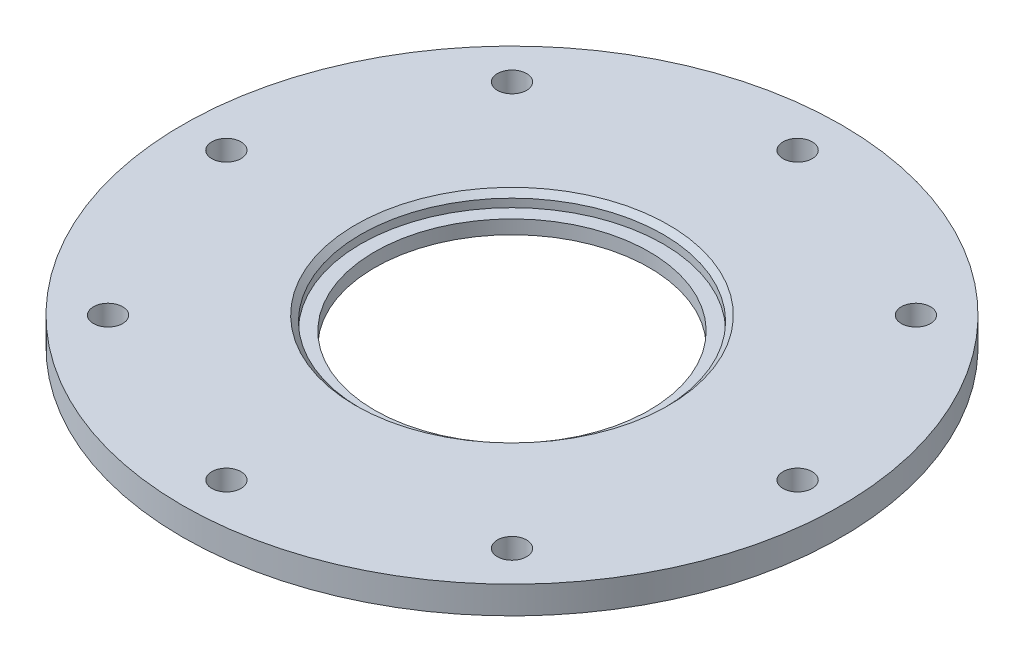
ISO-10303-21;
HEADER;
FILE_DESCRIPTION(('STEP AP214'),'2;1');
FILE_NAME('part.step','',(''),(''),'','','');
FILE_SCHEMA(('AUTOMOTIVE_DESIGN { 1 0 10303 214 1 1 1 1 }'));
ENDSEC;
DATA;
#1=APPLICATION_CONTEXT('core data for automotive mechanical design processes');
#2=APPLICATION_PROTOCOL_DEFINITION('international standard','automotive_design',2000,#1);
#3=PRODUCT_CONTEXT('',#1,'mechanical');
#4=PRODUCT('Part','Part','',(#3));
#5=PRODUCT_RELATED_PRODUCT_CATEGORY('part','',(#4));
#6=PRODUCT_DEFINITION_FORMATION('','',#4);
#7=PRODUCT_DEFINITION_CONTEXT('part definition',#1,'design');
#8=PRODUCT_DEFINITION('design','',#6,#7);
#9=PRODUCT_DEFINITION_SHAPE('','',#8);
#10=(LENGTH_UNIT() NAMED_UNIT(*) SI_UNIT(.MILLI.,.METRE.));
#11=(NAMED_UNIT(*) PLANE_ANGLE_UNIT() SI_UNIT($,.RADIAN.));
#12=(NAMED_UNIT(*) SI_UNIT($,.STERADIAN.) SOLID_ANGLE_UNIT());
#13=UNCERTAINTY_MEASURE_WITH_UNIT(LENGTH_MEASURE(1.E-05),#10,'distance_accuracy_value','');
#14=(GEOMETRIC_REPRESENTATION_CONTEXT(3) GLOBAL_UNCERTAINTY_ASSIGNED_CONTEXT((#13)) GLOBAL_UNIT_ASSIGNED_CONTEXT((#10,
#11,#12)) REPRESENTATION_CONTEXT('',''));
#15=CARTESIAN_POINT('',(0.,0.,0.));
#16=DIRECTION('',(0.,0.,1.));
#17=DIRECTION('',(1.,0.,0.));
#18=AXIS2_PLACEMENT_3D('',#15,#16,#17);
#19=CARTESIAN_POINT('',(0.,6.35,0.));
#20=DIRECTION('',(0.,1.,0.));
#21=DIRECTION('',(0.,0.,1.));
#22=AXIS2_PLACEMENT_3D('',#19,#20,#21);
#23=PLANE('',#22);
#24=CARTESIAN_POINT('',(0.,6.35,0.));
#25=DIRECTION('',(0.,1.,0.));
#26=DIRECTION('',(0.,0.,1.));
#27=AXIS2_PLACEMENT_3D('',#24,#25,#26);
#28=CIRCLE('',#27,36.195);
#29=CARTESIAN_POINT('',(0.,6.35,36.195));
#30=VERTEX_POINT('',#29);
#31=EDGE_CURVE('E40',#30,#30,#28,.F.);
#32=ORIENTED_EDGE('',*,*,#31,.T.);
#33=EDGE_LOOP('',(#32));
#34=FACE_BOUND('',#33,.T.);
#35=CARTESIAN_POINT('',(46.697331829559,6.35,46.6973318295602));
#36=DIRECTION('',(0.,1.,0.));
#37=DIRECTION('',(0.,0.,1.));
#38=AXIS2_PLACEMENT_3D('',#35,#36,#37);
#39=CIRCLE('',#38,3.3782);
#40=CARTESIAN_POINT('',(46.697331829559,6.35,50.0755318295602));
#41=VERTEX_POINT('',#40);
#42=EDGE_CURVE('E101',#41,#41,#39,.T.);
#43=ORIENTED_EDGE('',*,*,#42,.F.);
#44=EDGE_LOOP('',(#43));
#45=FACE_BOUND('',#44,.T.);
#46=CARTESIAN_POINT('',(66.04,6.35,6.83644715390033E-13));
#47=DIRECTION('',(0.,1.,0.));
#48=DIRECTION('',(0.,0.,1.));
#49=AXIS2_PLACEMENT_3D('',#46,#47,#48);
#50=CIRCLE('',#49,3.3782);
#51=CARTESIAN_POINT('',(66.04,6.35,3.37820000000068));
#52=VERTEX_POINT('',#51);
#53=EDGE_CURVE('E95',#52,#52,#50,.T.);
#54=ORIENTED_EDGE('',*,*,#53,.F.);
#55=EDGE_LOOP('',(#54));
#56=FACE_BOUND('',#55,.T.);
#57=CARTESIAN_POINT('',(46.69733182956,6.35,-46.6973318295592));
#58=DIRECTION('',(0.,1.,0.));
#59=DIRECTION('',(0.,0.,1.));
#60=AXIS2_PLACEMENT_3D('',#57,#58,#59);
#61=CIRCLE('',#60,3.3782);
#62=CARTESIAN_POINT('',(46.69733182956,6.35,-43.3191318295592));
#63=VERTEX_POINT('',#62);
#64=EDGE_CURVE('E89',#63,#63,#61,.T.);
#65=ORIENTED_EDGE('',*,*,#64,.F.);
#66=EDGE_LOOP('',(#65));
#67=FACE_BOUND('',#66,.T.);
#68=CARTESIAN_POINT('',(0.,6.35,-66.04));
#69=DIRECTION('',(0.,1.,0.));
#70=DIRECTION('',(0.,0.,1.));
#71=AXIS2_PLACEMENT_3D('',#68,#69,#70);
#72=CIRCLE('',#71,3.3782);
#73=CARTESIAN_POINT('',(0.,6.35,-62.6618));
#74=VERTEX_POINT('',#73);
#75=EDGE_CURVE('E83',#74,#74,#72,.T.);
#76=ORIENTED_EDGE('',*,*,#75,.F.);
#77=EDGE_LOOP('',(#76));
#78=FACE_BOUND('',#77,.T.);
#79=CARTESIAN_POINT('',(-46.6973318295594,6.35,-46.6973318295598));
#80=DIRECTION('',(0.,1.,0.));
#81=DIRECTION('',(0.,0.,1.));
#82=AXIS2_PLACEMENT_3D('',#79,#80,#81);
#83=CIRCLE('',#82,3.3782);
#84=CARTESIAN_POINT('',(-46.6973318295594,6.35,-43.3191318295598));
#85=VERTEX_POINT('',#84);
#86=EDGE_CURVE('E77',#85,#85,#83,.T.);
#87=ORIENTED_EDGE('',*,*,#86,.F.);
#88=EDGE_LOOP('',(#87));
#89=FACE_BOUND('',#88,.T.);
#90=CARTESIAN_POINT('',(-66.04,6.35,-2.22489860155631E-13));
#91=DIRECTION('',(0.,1.,0.));
#92=DIRECTION('',(0.,0.,1.));
#93=AXIS2_PLACEMENT_3D('',#90,#91,#92);
#94=CIRCLE('',#93,3.3782);
#95=CARTESIAN_POINT('',(-66.04,6.35,3.37819999999978));
#96=VERTEX_POINT('',#95);
#97=EDGE_CURVE('E71',#96,#96,#94,.T.);
#98=ORIENTED_EDGE('',*,*,#97,.F.);
#99=EDGE_LOOP('',(#98));
#100=FACE_BOUND('',#99,.T.);
#101=CARTESIAN_POINT('',(-46.6973318295597,6.35,46.6973318295595));
#102=DIRECTION('',(0.,1.,0.));
#103=DIRECTION('',(0.,0.,1.));
#104=AXIS2_PLACEMENT_3D('',#101,#102,#103);
#105=CIRCLE('',#104,3.3782);
#106=CARTESIAN_POINT('',(-46.6973318295597,6.35,50.0755318295595));
#107=VERTEX_POINT('',#106);
#108=EDGE_CURVE('E65',#107,#107,#105,.T.);
#109=ORIENTED_EDGE('',*,*,#108,.F.);
#110=EDGE_LOOP('',(#109));
#111=FACE_BOUND('',#110,.T.);
#112=CARTESIAN_POINT('',(0.,6.35,66.04));
#113=DIRECTION('',(0.,1.,0.));
#114=DIRECTION('',(0.,0.,1.));
#115=AXIS2_PLACEMENT_3D('',#112,#113,#114);
#116=CIRCLE('',#115,3.3782);
#117=CARTESIAN_POINT('',(0.,6.35,69.4182));
#118=VERTEX_POINT('',#117);
#119=EDGE_CURVE('E59',#118,#118,#116,.T.);
#120=ORIENTED_EDGE('',*,*,#119,.F.);
#121=EDGE_LOOP('',(#120));
#122=FACE_BOUND('',#121,.T.);
#123=CARTESIAN_POINT('',(0.,6.35,0.));
#124=DIRECTION('',(0.,1.,0.));
#125=DIRECTION('',(0.,0.,1.));
#126=AXIS2_PLACEMENT_3D('',#123,#124,#125);
#127=CIRCLE('',#126,76.2);
#128=CARTESIAN_POINT('',(0.,6.35,76.2));
#129=VERTEX_POINT('',#128);
#130=EDGE_CURVE('E48',#129,#129,#127,.T.);
#131=ORIENTED_EDGE('',*,*,#130,.T.);
#132=EDGE_LOOP('',(#131));
#133=FACE_BOUND('',#132,.T.);
#134=ADVANCED_FACE('F33',(#34,#45,#56,#67,#78,#89,#100,#111,#122,#133),#23,.T.);
#135=CARTESIAN_POINT('',(0.,0.,0.));
#136=DIRECTION('',(0.,1.,0.));
#137=DIRECTION('',(0.,0.,1.));
#138=AXIS2_PLACEMENT_3D('',#135,#136,#137);
#139=PLANE('',#138);
#140=CARTESIAN_POINT('',(46.697331829559,0.,46.6973318295602));
#141=DIRECTION('',(0.,1.,0.));
#142=DIRECTION('',(0.,0.,1.));
#143=AXIS2_PLACEMENT_3D('',#140,#141,#142);
#144=CIRCLE('',#143,3.37819999999999);
#145=CARTESIAN_POINT('',(46.697331829559,0.,50.0755318295601));
#146=VERTEX_POINT('',#145);
#147=EDGE_CURVE('E98',#146,#146,#144,.T.);
#148=ORIENTED_EDGE('',*,*,#147,.T.);
#149=EDGE_LOOP('',(#148));
#150=FACE_BOUND('',#149,.T.);
#151=CARTESIAN_POINT('',(66.04,0.,6.83644715390033E-13));
#152=DIRECTION('',(0.,1.,0.));
#153=DIRECTION('',(0.,0.,1.));
#154=AXIS2_PLACEMENT_3D('',#151,#152,#153);
#155=CIRCLE('',#154,3.3782);
#156=CARTESIAN_POINT('',(66.04,0.,3.37820000000068));
#157=VERTEX_POINT('',#156);
#158=EDGE_CURVE('E92',#157,#157,#155,.T.);
#159=ORIENTED_EDGE('',*,*,#158,.T.);
#160=EDGE_LOOP('',(#159));
#161=FACE_BOUND('',#160,.T.);
#162=CARTESIAN_POINT('',(46.69733182956,0.,-46.6973318295592));
#163=DIRECTION('',(0.,1.,0.));
#164=DIRECTION('',(0.,0.,1.));
#165=AXIS2_PLACEMENT_3D('',#162,#163,#164);
#166=CIRCLE('',#165,3.37819999999999);
#167=CARTESIAN_POINT('',(46.69733182956,0.,-43.3191318295592));
#168=VERTEX_POINT('',#167);
#169=EDGE_CURVE('E86',#168,#168,#166,.T.);
#170=ORIENTED_EDGE('',*,*,#169,.T.);
#171=EDGE_LOOP('',(#170));
#172=FACE_BOUND('',#171,.T.);
#173=CARTESIAN_POINT('',(0.,0.,-66.04));
#174=DIRECTION('',(0.,1.,0.));
#175=DIRECTION('',(0.,0.,1.));
#176=AXIS2_PLACEMENT_3D('',#173,#174,#175);
#177=CIRCLE('',#176,3.3782);
#178=CARTESIAN_POINT('',(0.,0.,-62.6618));
#179=VERTEX_POINT('',#178);
#180=EDGE_CURVE('E80',#179,#179,#177,.T.);
#181=ORIENTED_EDGE('',*,*,#180,.T.);
#182=EDGE_LOOP('',(#181));
#183=FACE_BOUND('',#182,.T.);
#184=CARTESIAN_POINT('',(-46.6973318295594,0.,-46.6973318295598));
#185=DIRECTION('',(0.,1.,0.));
#186=DIRECTION('',(0.,0.,1.));
#187=AXIS2_PLACEMENT_3D('',#184,#185,#186);
#188=CIRCLE('',#187,3.37819999999999);
#189=CARTESIAN_POINT('',(-46.6973318295594,0.,-43.3191318295599));
#190=VERTEX_POINT('',#189);
#191=EDGE_CURVE('E74',#190,#190,#188,.T.);
#192=ORIENTED_EDGE('',*,*,#191,.T.);
#193=EDGE_LOOP('',(#192));
#194=FACE_BOUND('',#193,.T.);
#195=CARTESIAN_POINT('',(-66.04,0.,-2.22489860155631E-13));
#196=DIRECTION('',(0.,1.,0.));
#197=DIRECTION('',(0.,0.,1.));
#198=AXIS2_PLACEMENT_3D('',#195,#196,#197);
#199=CIRCLE('',#198,3.3782);
#200=CARTESIAN_POINT('',(-66.04,0.,3.37819999999978));
#201=VERTEX_POINT('',#200);
#202=EDGE_CURVE('E68',#201,#201,#199,.T.);
#203=ORIENTED_EDGE('',*,*,#202,.T.);
#204=EDGE_LOOP('',(#203));
#205=FACE_BOUND('',#204,.T.);
#206=CARTESIAN_POINT('',(-46.6973318295597,0.,46.6973318295595));
#207=DIRECTION('',(0.,1.,0.));
#208=DIRECTION('',(0.,0.,1.));
#209=AXIS2_PLACEMENT_3D('',#206,#207,#208);
#210=CIRCLE('',#209,3.37819999999999);
#211=CARTESIAN_POINT('',(-46.6973318295597,0.,50.0755318295595));
#212=VERTEX_POINT('',#211);
#213=EDGE_CURVE('E62',#212,#212,#210,.T.);
#214=ORIENTED_EDGE('',*,*,#213,.T.);
#215=EDGE_LOOP('',(#214));
#216=FACE_BOUND('',#215,.T.);
#217=CARTESIAN_POINT('',(0.,0.,66.04));
#218=DIRECTION('',(0.,1.,0.));
#219=DIRECTION('',(0.,0.,1.));
#220=AXIS2_PLACEMENT_3D('',#217,#218,#219);
#221=CIRCLE('',#220,3.3782);
#222=CARTESIAN_POINT('',(0.,0.,69.4182));
#223=VERTEX_POINT('',#222);
#224=EDGE_CURVE('E54',#223,#223,#221,.T.);
#225=ORIENTED_EDGE('',*,*,#224,.T.);
#226=EDGE_LOOP('',(#225));
#227=FACE_BOUND('',#226,.T.);
#228=CARTESIAN_POINT('',(0.,0.,0.));
#229=DIRECTION('',(0.,1.,0.));
#230=DIRECTION('',(0.,0.,1.));
#231=AXIS2_PLACEMENT_3D('',#228,#229,#230);
#232=CIRCLE('',#231,76.2);
#233=CARTESIAN_POINT('',(0.,0.,76.2));
#234=VERTEX_POINT('',#233);
#235=EDGE_CURVE('E51',#234,#234,#232,.T.);
#236=ORIENTED_EDGE('',*,*,#235,.F.);
#237=EDGE_LOOP('',(#236));
#238=FACE_BOUND('',#237,.T.);
#239=CARTESIAN_POINT('',(0.,0.,0.));
#240=DIRECTION('',(0.,1.,0.));
#241=DIRECTION('',(0.,0.,1.));
#242=AXIS2_PLACEMENT_3D('',#239,#240,#241);
#243=CIRCLE('',#242,31.75);
#244=CARTESIAN_POINT('',(0.,0.,31.75));
#245=VERTEX_POINT('',#244);
#246=EDGE_CURVE('E105',#245,#245,#243,.T.);
#247=ORIENTED_EDGE('',*,*,#246,.T.);
#248=EDGE_LOOP('',(#247));
#249=FACE_BOUND('',#248,.T.);
#250=ADVANCED_FACE('F126',(#150,#161,#172,#183,#194,#205,#216,#227,#238,#249),#139,.F.);
#251=CARTESIAN_POINT('',(0.,6.35,0.));
#252=DIRECTION('',(0.,-1.,0.));
#253=DIRECTION('',(0.,0.,-1.));
#254=AXIS2_PLACEMENT_3D('',#251,#252,#253);
#255=CYLINDRICAL_SURFACE('',#254,76.2);
#256=ORIENTED_EDGE('',*,*,#130,.F.);
#257=EDGE_LOOP('',(#256));
#258=FACE_BOUND('',#257,.T.);
#259=ORIENTED_EDGE('',*,*,#235,.T.);
#260=EDGE_LOOP('',(#259));
#261=FACE_BOUND('',#260,.T.);
#262=ADVANCED_FACE('F131',(#258,#261),#255,.T.);
#263=CARTESIAN_POINT('',(0.,6.35,0.));
#264=DIRECTION('',(0.,-1.,0.));
#265=DIRECTION('',(0.,0.,-1.));
#266=AXIS2_PLACEMENT_3D('',#263,#264,#265);
#267=CYLINDRICAL_SURFACE('',#266,34.925);
#268=CARTESIAN_POINT('',(0.,3.175,0.));
#269=DIRECTION('',(0.,1.,0.));
#270=DIRECTION('',(0.,0.,1.));
#271=AXIS2_PLACEMENT_3D('',#268,#269,#270);
#272=CIRCLE('',#271,34.925);
#273=CARTESIAN_POINT('',(0.,3.175,34.925));
#274=VERTEX_POINT('',#273);
#275=EDGE_CURVE('E10',#274,#274,#272,.T.);
#276=ORIENTED_EDGE('',*,*,#275,.F.);
#277=EDGE_LOOP('',(#276));
#278=FACE_BOUND('',#277,.T.);
#279=CARTESIAN_POINT('',(0.,5.08000000000001,0.));
#280=DIRECTION('',(0.,1.,0.));
#281=DIRECTION('',(0.,0.,1.));
#282=AXIS2_PLACEMENT_3D('',#279,#280,#281);
#283=CIRCLE('',#282,34.925);
#284=CARTESIAN_POINT('',(0.,5.08000000000001,34.925));
#285=VERTEX_POINT('',#284);
#286=EDGE_CURVE('E44',#285,#285,#283,.T.);
#287=ORIENTED_EDGE('',*,*,#286,.T.);
#288=EDGE_LOOP('',(#287));
#289=FACE_BOUND('',#288,.T.);
#290=ADVANCED_FACE('F136',(#278,#289),#267,.F.);
#291=CARTESIAN_POINT('',(0.,6.35,66.04));
#292=DIRECTION('',(0.,1.,0.));
#293=DIRECTION('',(0.,0.,1.));
#294=AXIS2_PLACEMENT_3D('',#291,#292,#293);
#295=CYLINDRICAL_SURFACE('',#294,3.3782);
#296=ORIENTED_EDGE('',*,*,#119,.T.);
#297=EDGE_LOOP('',(#296));
#298=FACE_BOUND('',#297,.T.);
#299=ORIENTED_EDGE('',*,*,#224,.F.);
#300=EDGE_LOOP('',(#299));
#301=FACE_BOUND('',#300,.T.);
#302=ADVANCED_FACE('F143',(#298,#301),#295,.F.);
#303=CARTESIAN_POINT('',(-46.6973318295597,6.35,46.6973318295595));
#304=DIRECTION('',(0.,1.,0.));
#305=DIRECTION('',(0.,0.,1.));
#306=AXIS2_PLACEMENT_3D('',#303,#304,#305);
#307=CYLINDRICAL_SURFACE('',#306,3.37819999999999);
#308=ORIENTED_EDGE('',*,*,#108,.T.);
#309=EDGE_LOOP('',(#308));
#310=FACE_BOUND('',#309,.T.);
#311=ORIENTED_EDGE('',*,*,#213,.F.);
#312=EDGE_LOOP('',(#311));
#313=FACE_BOUND('',#312,.T.);
#314=ADVANCED_FACE('F155',(#310,#313),#307,.F.);
#315=CARTESIAN_POINT('',(-66.04,6.35,-2.22489860155631E-13));
#316=DIRECTION('',(0.,1.,0.));
#317=DIRECTION('',(0.,0.,1.));
#318=AXIS2_PLACEMENT_3D('',#315,#316,#317);
#319=CYLINDRICAL_SURFACE('',#318,3.3782);
#320=ORIENTED_EDGE('',*,*,#97,.T.);
#321=EDGE_LOOP('',(#320));
#322=FACE_BOUND('',#321,.T.);
#323=ORIENTED_EDGE('',*,*,#202,.F.);
#324=EDGE_LOOP('',(#323));
#325=FACE_BOUND('',#324,.T.);
#326=ADVANCED_FACE('F163',(#322,#325),#319,.F.);
#327=CARTESIAN_POINT('',(-46.6973318295594,6.35,-46.6973318295598));
#328=DIRECTION('',(0.,1.,0.));
#329=DIRECTION('',(0.,0.,1.));
#330=AXIS2_PLACEMENT_3D('',#327,#328,#329);
#331=CYLINDRICAL_SURFACE('',#330,3.37819999999999);
#332=ORIENTED_EDGE('',*,*,#86,.T.);
#333=EDGE_LOOP('',(#332));
#334=FACE_BOUND('',#333,.T.);
#335=ORIENTED_EDGE('',*,*,#191,.F.);
#336=EDGE_LOOP('',(#335));
#337=FACE_BOUND('',#336,.T.);
#338=ADVANCED_FACE('F170',(#334,#337),#331,.F.);
#339=CARTESIAN_POINT('',(0.,6.35,-66.04));
#340=DIRECTION('',(0.,1.,0.));
#341=DIRECTION('',(0.,0.,1.));
#342=AXIS2_PLACEMENT_3D('',#339,#340,#341);
#343=CYLINDRICAL_SURFACE('',#342,3.3782);
#344=ORIENTED_EDGE('',*,*,#75,.T.);
#345=EDGE_LOOP('',(#344));
#346=FACE_BOUND('',#345,.T.);
#347=ORIENTED_EDGE('',*,*,#180,.F.);
#348=EDGE_LOOP('',(#347));
#349=FACE_BOUND('',#348,.T.);
#350=ADVANCED_FACE('F174',(#346,#349),#343,.F.);
#351=CARTESIAN_POINT('',(46.69733182956,6.35,-46.6973318295592));
#352=DIRECTION('',(0.,1.,0.));
#353=DIRECTION('',(0.,0.,1.));
#354=AXIS2_PLACEMENT_3D('',#351,#352,#353);
#355=CYLINDRICAL_SURFACE('',#354,3.37819999999999);
#356=ORIENTED_EDGE('',*,*,#64,.T.);
#357=EDGE_LOOP('',(#356));
#358=FACE_BOUND('',#357,.T.);
#359=ORIENTED_EDGE('',*,*,#169,.F.);
#360=EDGE_LOOP('',(#359));
#361=FACE_BOUND('',#360,.T.);
#362=ADVANCED_FACE('F178',(#358,#361),#355,.F.);
#363=CARTESIAN_POINT('',(66.04,6.35,6.83644715390033E-13));
#364=DIRECTION('',(0.,1.,0.));
#365=DIRECTION('',(0.,0.,1.));
#366=AXIS2_PLACEMENT_3D('',#363,#364,#365);
#367=CYLINDRICAL_SURFACE('',#366,3.3782);
#368=ORIENTED_EDGE('',*,*,#53,.T.);
#369=EDGE_LOOP('',(#368));
#370=FACE_BOUND('',#369,.T.);
#371=ORIENTED_EDGE('',*,*,#158,.F.);
#372=EDGE_LOOP('',(#371));
#373=FACE_BOUND('',#372,.T.);
#374=ADVANCED_FACE('F182',(#370,#373),#367,.F.);
#375=CARTESIAN_POINT('',(46.697331829559,6.35,46.6973318295602));
#376=DIRECTION('',(0.,1.,0.));
#377=DIRECTION('',(0.,0.,1.));
#378=AXIS2_PLACEMENT_3D('',#375,#376,#377);
#379=CYLINDRICAL_SURFACE('',#378,3.37819999999999);
#380=ORIENTED_EDGE('',*,*,#42,.T.);
#381=EDGE_LOOP('',(#380));
#382=FACE_BOUND('',#381,.T.);
#383=ORIENTED_EDGE('',*,*,#147,.F.);
#384=EDGE_LOOP('',(#383));
#385=FACE_BOUND('',#384,.T.);
#386=ADVANCED_FACE('F122',(#382,#385),#379,.F.);
#387=CARTESIAN_POINT('',(0.,5.08000000000001,0.));
#388=DIRECTION('',(0.,1.,0.));
#389=DIRECTION('',(0.,0.,1.));
#390=AXIS2_PLACEMENT_3D('',#387,#388,#389);
#391=CONICAL_SURFACE('',#390,34.925,0.785398163397454);
#392=ORIENTED_EDGE('',*,*,#31,.F.);
#393=EDGE_LOOP('',(#392));
#394=FACE_BOUND('',#393,.T.);
#395=ORIENTED_EDGE('',*,*,#286,.F.);
#396=EDGE_LOOP('',(#395));
#397=FACE_BOUND('',#396,.T.);
#398=ADVANCED_FACE('F35',(#394,#397),#391,.F.);
#399=CARTESIAN_POINT('',(0.,3.175,0.));
#400=DIRECTION('',(0.,1.,0.));
#401=DIRECTION('',(0.,0.,1.));
#402=AXIS2_PLACEMENT_3D('',#399,#400,#401);
#403=PLANE('',#402);
#404=ORIENTED_EDGE('',*,*,#275,.T.);
#405=EDGE_LOOP('',(#404));
#406=FACE_BOUND('',#405,.T.);
#407=CARTESIAN_POINT('',(0.,3.175,0.));
#408=DIRECTION('',(0.,1.,0.));
#409=DIRECTION('',(0.,0.,1.));
#410=AXIS2_PLACEMENT_3D('',#407,#408,#409);
#411=CIRCLE('',#410,31.75);
#412=CARTESIAN_POINT('',(0.,3.175,31.75));
#413=VERTEX_POINT('',#412);
#414=EDGE_CURVE('E104',#413,#413,#411,.T.);
#415=ORIENTED_EDGE('',*,*,#414,.F.);
#416=EDGE_LOOP('',(#415));
#417=FACE_BOUND('',#416,.T.);
#418=ADVANCED_FACE('F114',(#406,#417),#403,.T.);
#419=CARTESIAN_POINT('',(0.,3.175,0.));
#420=DIRECTION('',(0.,-1.,0.));
#421=DIRECTION('',(0.,0.,-1.));
#422=AXIS2_PLACEMENT_3D('',#419,#420,#421);
#423=CYLINDRICAL_SURFACE('',#422,31.75);
#424=ORIENTED_EDGE('',*,*,#414,.T.);
#425=EDGE_LOOP('',(#424));
#426=FACE_BOUND('',#425,.T.);
#427=ORIENTED_EDGE('',*,*,#246,.F.);
#428=EDGE_LOOP('',(#427));
#429=FACE_BOUND('',#428,.T.);
#430=ADVANCED_FACE('F111',(#426,#429),#423,.F.);
#431=CLOSED_SHELL('',(#134,#250,#262,#290,#302,#314,#326,#338,#350,#362,#374,#386,#398,#418,#430));
#432=MANIFOLD_SOLID_BREP('B2',#431);
#433=ADVANCED_BREP_SHAPE_REPRESENTATION('',(#18,#432),#14);
#434=SHAPE_DEFINITION_REPRESENTATION(#9,#433);
ENDSEC;
END-ISO-10303-21;
